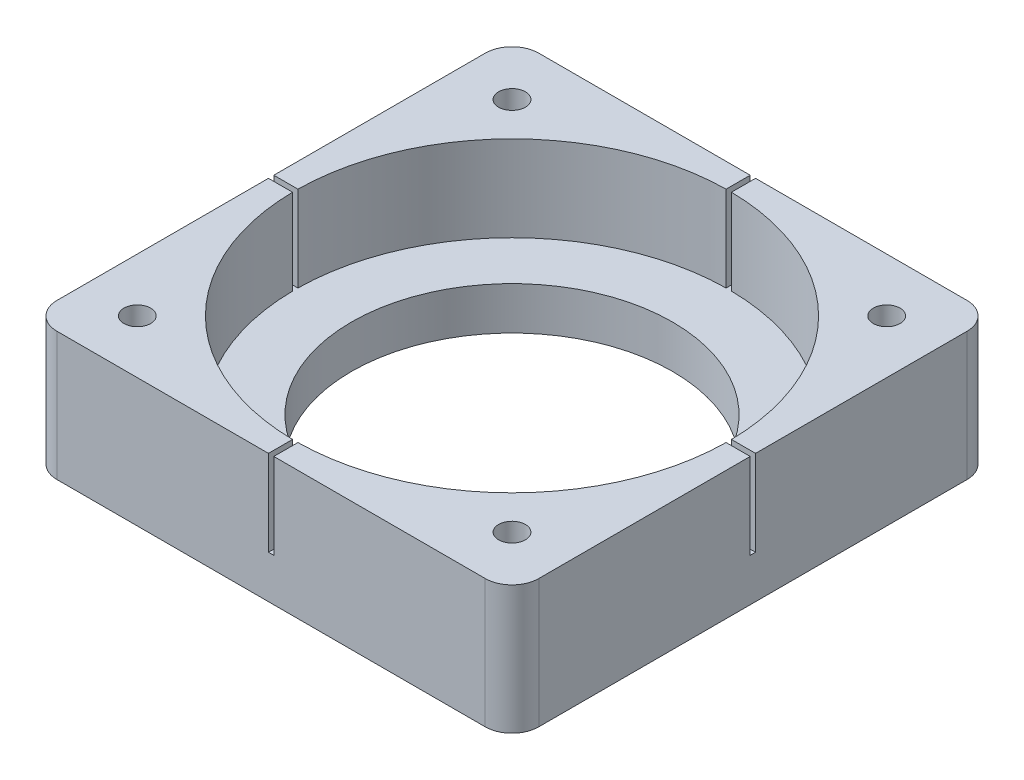
ISO-10303-21;
HEADER;
FILE_DESCRIPTION(('STEP AP214'),'2;1');
FILE_NAME('part.step','',(''),(''),'','','');
FILE_SCHEMA(('AUTOMOTIVE_DESIGN { 1 0 10303 214 1 1 1 1 }'));
ENDSEC;
DATA;
#1=APPLICATION_CONTEXT('core data for automotive mechanical design processes');
#2=APPLICATION_PROTOCOL_DEFINITION('international standard','automotive_design',2000,#1);
#3=PRODUCT_CONTEXT('',#1,'mechanical');
#4=PRODUCT('Part','Part','',(#3));
#5=PRODUCT_RELATED_PRODUCT_CATEGORY('part','',(#4));
#6=PRODUCT_DEFINITION_FORMATION('','',#4);
#7=PRODUCT_DEFINITION_CONTEXT('part definition',#1,'design');
#8=PRODUCT_DEFINITION('design','',#6,#7);
#9=PRODUCT_DEFINITION_SHAPE('','',#8);
#10=(LENGTH_UNIT() NAMED_UNIT(*) SI_UNIT(.MILLI.,.METRE.));
#11=(NAMED_UNIT(*) PLANE_ANGLE_UNIT() SI_UNIT($,.RADIAN.));
#12=(NAMED_UNIT(*) SI_UNIT($,.STERADIAN.) SOLID_ANGLE_UNIT());
#13=UNCERTAINTY_MEASURE_WITH_UNIT(LENGTH_MEASURE(1.E-05),#10,'distance_accuracy_value','');
#14=(GEOMETRIC_REPRESENTATION_CONTEXT(3) GLOBAL_UNCERTAINTY_ASSIGNED_CONTEXT((#13)) GLOBAL_UNIT_ASSIGNED_CONTEXT((#10,
#11,#12)) REPRESENTATION_CONTEXT('',''));
#15=CARTESIAN_POINT('',(0.,0.,0.));
#16=DIRECTION('',(0.,0.,1.));
#17=DIRECTION('',(1.,0.,0.));
#18=AXIS2_PLACEMENT_3D('',#15,#16,#17);
#19=CARTESIAN_POINT('',(0.,24.,0.));
#20=DIRECTION('',(0.,1.,0.));
#21=DIRECTION('',(0.,0.,1.));
#22=AXIS2_PLACEMENT_3D('',#19,#20,#21);
#23=PLANE('',#22);
#24=DIRECTION('',(0.,0.,-1.));
#25=VECTOR('',#24,1.);
#26=CARTESIAN_POINT('',(0.499999999999994,24.,-49.3592191642469));
#27=LINE('',#26,#25);
#28=CARTESIAN_POINT('',(0.499999999999996,24.,-40.4969134626332));
#29=VERTEX_POINT('',#28);
#30=CARTESIAN_POINT('',(0.499999999999995,24.,-44.9999999999999));
#31=VERTEX_POINT('',#30);
#32=EDGE_CURVE('E556',#29,#31,#27,.T.);
#33=ORIENTED_EDGE('',*,*,#32,.F.);
#34=CARTESIAN_POINT('',(0.,24.,0.));
#35=DIRECTION('',(0.,1.,0.));
#36=DIRECTION('',(0.,0.,1.));
#37=AXIS2_PLACEMENT_3D('',#34,#35,#36);
#38=CIRCLE('',#37,40.5);
#39=CARTESIAN_POINT('',(40.4969134626332,24.,-0.500000000001507));
#40=VERTEX_POINT('',#39);
#41=EDGE_CURVE('E331',#40,#29,#38,.T.);
#42=ORIENTED_EDGE('',*,*,#41,.F.);
#43=DIRECTION('',(-1.,0.,0.));
#44=VECTOR('',#43,1.);
#45=CARTESIAN_POINT('',(49.3592191642485,24.,-0.500000000001508));
#46=LINE('',#45,#44);
#47=CARTESIAN_POINT('',(45.,24.,-0.500000000001507));
#48=VERTEX_POINT('',#47);
#49=EDGE_CURVE('E549',#48,#40,#46,.T.);
#50=ORIENTED_EDGE('',*,*,#49,.F.);
#51=DIRECTION('',(0.,0.,-1.));
#52=VECTOR('',#51,1.);
#53=CARTESIAN_POINT('',(45.,24.,0.));
#54=LINE('',#53,#52);
#55=CARTESIAN_POINT('',(45.,24.,-39.9999999999999));
#56=VERTEX_POINT('',#55);
#57=EDGE_CURVE('E336',#48,#56,#54,.T.);
#58=ORIENTED_EDGE('',*,*,#57,.T.);
#59=CARTESIAN_POINT('',(40.,24.,-39.9999999999999));
#60=DIRECTION('',(0.,1.,0.));
#61=DIRECTION('',(0.,0.,1.));
#62=AXIS2_PLACEMENT_3D('',#59,#60,#61);
#63=CIRCLE('',#62,5.);
#64=CARTESIAN_POINT('',(40.,24.,-44.9999999999999));
#65=VERTEX_POINT('',#64);
#66=EDGE_CURVE('E403',#56,#65,#63,.T.);
#67=ORIENTED_EDGE('',*,*,#66,.T.);
#68=DIRECTION('',(1.,0.,0.));
#69=VECTOR('',#68,1.);
#70=CARTESIAN_POINT('',(0.,24.,-44.9999999999999));
#71=LINE('',#70,#69);
#72=EDGE_CURVE('E342',#31,#65,#71,.T.);
#73=ORIENTED_EDGE('',*,*,#72,.F.);
#74=EDGE_LOOP('',(#33,#42,#50,#58,#67,#73));
#75=FACE_BOUND('',#74,.T.);
#76=CARTESIAN_POINT('',(35.,24.,-35.));
#77=DIRECTION('',(0.,-1.,0.));
#78=DIRECTION('',(0.,0.,-1.));
#79=AXIS2_PLACEMENT_3D('',#76,#77,#78);
#80=CIRCLE('',#79,2.5);
#81=CARTESIAN_POINT('',(35.,24.,-37.5));
#82=VERTEX_POINT('',#81);
#83=EDGE_CURVE('E315',#82,#82,#80,.T.);
#84=ORIENTED_EDGE('',*,*,#83,.T.);
#85=EDGE_LOOP('',(#84));
#86=FACE_BOUND('',#85,.T.);
#87=ADVANCED_FACE('F72',(#75,#86),#23,.T.);
#88=DIRECTION('',(0.,0.,1.));
#89=VECTOR('',#88,1.);
#90=CARTESIAN_POINT('',(-0.500000000000006,24.,-49.3592191642469));
#91=LINE('',#90,#89);
#92=CARTESIAN_POINT('',(-0.500000000000006,24.,-44.9999999999999));
#93=VERTEX_POINT('',#92);
#94=CARTESIAN_POINT('',(-0.500000000000006,24.,-40.4969134626332));
#95=VERTEX_POINT('',#94);
#96=EDGE_CURVE('E559',#93,#95,#91,.T.);
#97=ORIENTED_EDGE('',*,*,#96,.F.);
#98=CARTESIAN_POINT('',(-40.,24.,-44.9999999999999));
#99=VERTEX_POINT('',#98);
#100=EDGE_CURVE('E343',#99,#93,#71,.T.);
#101=ORIENTED_EDGE('',*,*,#100,.F.);
#102=CARTESIAN_POINT('',(-40.,24.,-39.9999999999999));
#103=DIRECTION('',(0.,1.,0.));
#104=DIRECTION('',(0.,0.,1.));
#105=AXIS2_PLACEMENT_3D('',#102,#103,#104);
#106=CIRCLE('',#105,5.);
#107=CARTESIAN_POINT('',(-45.,24.,-39.9999999999999));
#108=VERTEX_POINT('',#107);
#109=EDGE_CURVE('E399',#99,#108,#106,.T.);
#110=ORIENTED_EDGE('',*,*,#109,.T.);
#111=DIRECTION('',(0.,0.,-1.));
#112=VECTOR('',#111,1.);
#113=CARTESIAN_POINT('',(-45.,24.,0.));
#114=LINE('',#113,#112);
#115=CARTESIAN_POINT('',(-45.,24.,-0.499999999998474));
#116=VERTEX_POINT('',#115);
#117=EDGE_CURVE('E347',#116,#108,#114,.T.);
#118=ORIENTED_EDGE('',*,*,#117,.F.);
#119=DIRECTION('',(-1.,0.,0.));
#120=VECTOR('',#119,1.);
#121=CARTESIAN_POINT('',(-49.3592191642454,24.,-0.499999999998472));
#122=LINE('',#121,#120);
#123=CARTESIAN_POINT('',(-40.4969134626332,24.,-0.499999999998476));
#124=VERTEX_POINT('',#123);
#125=EDGE_CURVE('E240',#124,#116,#122,.T.);
#126=ORIENTED_EDGE('',*,*,#125,.F.);
#127=EDGE_CURVE('E458',#95,#124,#38,.T.);
#128=ORIENTED_EDGE('',*,*,#127,.F.);
#129=EDGE_LOOP('',(#97,#101,#110,#118,#126,#128));
#130=FACE_BOUND('',#129,.T.);
#131=CARTESIAN_POINT('',(-35.,24.,-35.));
#132=DIRECTION('',(0.,-1.,0.));
#133=DIRECTION('',(0.,0.,-1.));
#134=AXIS2_PLACEMENT_3D('',#131,#132,#133);
#135=CIRCLE('',#134,2.5);
#136=CARTESIAN_POINT('',(-35.,24.,-37.5));
#137=VERTEX_POINT('',#136);
#138=EDGE_CURVE('E291',#137,#137,#135,.T.);
#139=ORIENTED_EDGE('',*,*,#138,.T.);
#140=EDGE_LOOP('',(#139));
#141=FACE_BOUND('',#140,.T.);
#142=ADVANCED_FACE('F590',(#130,#141),#23,.T.);
#143=DIRECTION('',(1.,0.,0.));
#144=VECTOR('',#143,1.);
#145=CARTESIAN_POINT('',(49.3592191642485,24.,0.499999999998492));
#146=LINE('',#145,#144);
#147=CARTESIAN_POINT('',(40.4969134626332,24.,0.499999999998495));
#148=VERTEX_POINT('',#147);
#149=CARTESIAN_POINT('',(45.,24.,0.499999999998494));
#150=VERTEX_POINT('',#149);
#151=EDGE_CURVE('E446',#148,#150,#146,.T.);
#152=ORIENTED_EDGE('',*,*,#151,.F.);
#153=CARTESIAN_POINT('',(0.500000000003022,24.,40.4969134626331));
#154=VERTEX_POINT('',#153);
#155=EDGE_CURVE('E327',#154,#148,#38,.T.);
#156=ORIENTED_EDGE('',*,*,#155,.F.);
#157=DIRECTION('',(0.,0.,-1.));
#158=VECTOR('',#157,1.);
#159=CARTESIAN_POINT('',(0.500000000003023,24.,49.359219164247));
#160=LINE('',#159,#158);
#161=CARTESIAN_POINT('',(0.500000000003023,24.,44.9999999999999));
#162=VERTEX_POINT('',#161);
#163=EDGE_CURVE('E448',#162,#154,#160,.T.);
#164=ORIENTED_EDGE('',*,*,#163,.F.);
#165=DIRECTION('',(1.,0.,0.));
#166=VECTOR('',#165,1.);
#167=CARTESIAN_POINT('',(0.,24.,44.9999999999999));
#168=LINE('',#167,#166);
#169=CARTESIAN_POINT('',(40.,24.,44.9999999999999));
#170=VERTEX_POINT('',#169);
#171=EDGE_CURVE('E337',#162,#170,#168,.T.);
#172=ORIENTED_EDGE('',*,*,#171,.T.);
#173=CARTESIAN_POINT('',(40.,24.,39.9999999999999));
#174=DIRECTION('',(0.,1.,0.));
#175=DIRECTION('',(0.,0.,1.));
#176=AXIS2_PLACEMENT_3D('',#173,#174,#175);
#177=CIRCLE('',#176,5.);
#178=CARTESIAN_POINT('',(45.,24.,39.9999999999999));
#179=VERTEX_POINT('',#178);
#180=EDGE_CURVE('E396',#170,#179,#177,.T.);
#181=ORIENTED_EDGE('',*,*,#180,.T.);
#182=EDGE_CURVE('E338',#179,#150,#54,.T.);
#183=ORIENTED_EDGE('',*,*,#182,.T.);
#184=EDGE_LOOP('',(#152,#156,#164,#172,#181,#183));
#185=FACE_BOUND('',#184,.T.);
#186=CARTESIAN_POINT('',(35.,24.,35.));
#187=DIRECTION('',(0.,-1.,0.));
#188=DIRECTION('',(0.,0.,-1.));
#189=AXIS2_PLACEMENT_3D('',#186,#187,#188);
#190=CIRCLE('',#189,2.5);
#191=CARTESIAN_POINT('',(35.,24.,32.5));
#192=VERTEX_POINT('',#191);
#193=EDGE_CURVE('E307',#192,#192,#190,.T.);
#194=ORIENTED_EDGE('',*,*,#193,.T.);
#195=EDGE_LOOP('',(#194));
#196=FACE_BOUND('',#195,.T.);
#197=ADVANCED_FACE('F443',(#185,#196),#23,.T.);
#198=CARTESIAN_POINT('',(0.,8.,0.));
#199=DIRECTION('',(0.,1.,0.));
#200=DIRECTION('',(0.,0.,1.));
#201=AXIS2_PLACEMENT_3D('',#198,#199,#200);
#202=CYLINDRICAL_SURFACE('',#201,40.5);
#203=ORIENTED_EDGE('',*,*,#41,.T.);
#204=DIRECTION('',(0.,1.,0.));
#205=VECTOR('',#204,1.);
#206=CARTESIAN_POINT('',(0.499999999999996,8.,-40.4969134626332));
#207=LINE('',#206,#205);
#208=CARTESIAN_POINT('',(0.499999999999996,8.,-40.4969134626332));
#209=VERTEX_POINT('',#208);
#210=EDGE_CURVE('E269',#29,#209,#207,.F.);
#211=ORIENTED_EDGE('',*,*,#210,.T.);
#212=CARTESIAN_POINT('',(0.,8.,0.));
#213=DIRECTION('',(0.,1.,0.));
#214=DIRECTION('',(0.,0.,1.));
#215=AXIS2_PLACEMENT_3D('',#212,#213,#214);
#216=CIRCLE('',#215,40.5);
#217=CARTESIAN_POINT('',(40.4969134626332,8.,-0.500000000001507));
#218=VERTEX_POINT('',#217);
#219=EDGE_CURVE('E325',#218,#209,#216,.T.);
#220=ORIENTED_EDGE('',*,*,#219,.F.);
#221=DIRECTION('',(0.,1.,0.));
#222=VECTOR('',#221,1.);
#223=CARTESIAN_POINT('',(40.4969134626332,8.,-0.500000000001507));
#224=LINE('',#223,#222);
#225=EDGE_CURVE('E519',#218,#40,#224,.T.);
#226=ORIENTED_EDGE('',*,*,#225,.T.);
#227=EDGE_LOOP('',(#203,#211,#220,#226));
#228=FACE_BOUND('',#227,.T.);
#229=ADVANCED_FACE('F537',(#228),#202,.F.);
#230=CARTESIAN_POINT('',(-0.500000000000006,8.,-40.4969134626332));
#231=VERTEX_POINT('',#230);
#232=CARTESIAN_POINT('',(-40.4969134626332,8.,-0.499999999998476));
#233=VERTEX_POINT('',#232);
#234=EDGE_CURVE('E253',#231,#233,#216,.T.);
#235=ORIENTED_EDGE('',*,*,#234,.F.);
#236=DIRECTION('',(0.,1.,0.));
#237=VECTOR('',#236,1.);
#238=CARTESIAN_POINT('',(-0.500000000000006,8.,-40.4969134626332));
#239=LINE('',#238,#237);
#240=EDGE_CURVE('E527',#231,#95,#239,.T.);
#241=ORIENTED_EDGE('',*,*,#240,.T.);
#242=ORIENTED_EDGE('',*,*,#127,.T.);
#243=DIRECTION('',(0.,1.,0.));
#244=VECTOR('',#243,1.);
#245=CARTESIAN_POINT('',(-40.4969134626332,8.,-0.499999999998476));
#246=LINE('',#245,#244);
#247=EDGE_CURVE('E246',#124,#233,#246,.F.);
#248=ORIENTED_EDGE('',*,*,#247,.T.);
#249=EDGE_LOOP('',(#235,#241,#242,#248));
#250=FACE_BOUND('',#249,.T.);
#251=ADVANCED_FACE('F610',(#250),#202,.F.);
#252=ORIENTED_EDGE('',*,*,#155,.T.);
#253=DIRECTION('',(0.,1.,0.));
#254=VECTOR('',#253,1.);
#255=CARTESIAN_POINT('',(40.4969134626332,8.,0.499999999998495));
#256=LINE('',#255,#254);
#257=CARTESIAN_POINT('',(40.4969134626332,8.,0.499999999998495));
#258=VERTEX_POINT('',#257);
#259=EDGE_CURVE('E513',#148,#258,#256,.F.);
#260=ORIENTED_EDGE('',*,*,#259,.T.);
#261=CARTESIAN_POINT('',(0.500000000003022,8.,40.4969134626331));
#262=VERTEX_POINT('',#261);
#263=EDGE_CURVE('E320',#262,#258,#216,.T.);
#264=ORIENTED_EDGE('',*,*,#263,.F.);
#265=DIRECTION('',(0.,1.,0.));
#266=VECTOR('',#265,1.);
#267=CARTESIAN_POINT('',(0.500000000003022,8.,40.4969134626331));
#268=LINE('',#267,#266);
#269=EDGE_CURVE('E506',#262,#154,#268,.T.);
#270=ORIENTED_EDGE('',*,*,#269,.T.);
#271=EDGE_LOOP('',(#252,#260,#264,#270));
#272=FACE_BOUND('',#271,.T.);
#273=ADVANCED_FACE('F614',(#272),#202,.F.);
#274=CARTESIAN_POINT('',(0.,24.,44.9999999999999));
#275=DIRECTION('',(0.,0.,-1.));
#276=DIRECTION('',(-1.,0.,0.));
#277=AXIS2_PLACEMENT_3D('',#274,#275,#276);
#278=PLANE('',#277);
#279=ORIENTED_EDGE('',*,*,#171,.F.);
#280=DIRECTION('',(0.,-1.,0.));
#281=VECTOR('',#280,1.);
#282=CARTESIAN_POINT('',(0.500000000003023,24.,44.9999999999999));
#283=LINE('',#282,#281);
#284=CARTESIAN_POINT('',(0.500000000003023,8.,44.9999999999999));
#285=VERTEX_POINT('',#284);
#286=EDGE_CURVE('E510',#162,#285,#283,.T.);
#287=ORIENTED_EDGE('',*,*,#286,.T.);
#288=DIRECTION('',(1.,0.,0.));
#289=VECTOR('',#288,1.);
#290=CARTESIAN_POINT('',(0.,8.,44.9999999999999));
#291=LINE('',#290,#289);
#292=CARTESIAN_POINT('',(-0.499999999996979,8.,44.9999999999999));
#293=VERTEX_POINT('',#292);
#294=EDGE_CURVE('E262',#293,#285,#291,.T.);
#295=ORIENTED_EDGE('',*,*,#294,.F.);
#296=DIRECTION('',(0.,1.,0.));
#297=VECTOR('',#296,1.);
#298=CARTESIAN_POINT('',(-0.499999999996979,24.,44.9999999999999));
#299=LINE('',#298,#297);
#300=CARTESIAN_POINT('',(-0.499999999996979,24.,44.9999999999999));
#301=VERTEX_POINT('',#300);
#302=EDGE_CURVE('E503',#293,#301,#299,.T.);
#303=ORIENTED_EDGE('',*,*,#302,.T.);
#304=CARTESIAN_POINT('',(-40.,24.,44.9999999999999));
#305=VERTEX_POINT('',#304);
#306=EDGE_CURVE('E332',#305,#301,#168,.T.);
#307=ORIENTED_EDGE('',*,*,#306,.F.);
#308=DIRECTION('',(0.,-1.,0.));
#309=VECTOR('',#308,1.);
#310=CARTESIAN_POINT('',(-40.,0.,44.9999999999999));
#311=LINE('',#310,#309);
#312=CARTESIAN_POINT('',(-40.,0.,44.9999999999999));
#313=VERTEX_POINT('',#312);
#314=EDGE_CURVE('E81',#305,#313,#311,.T.);
#315=ORIENTED_EDGE('',*,*,#314,.T.);
#316=DIRECTION('',(1.,0.,0.));
#317=VECTOR('',#316,1.);
#318=CARTESIAN_POINT('',(0.,0.,44.9999999999999));
#319=LINE('',#318,#317);
#320=CARTESIAN_POINT('',(40.,0.,44.9999999999999));
#321=VERTEX_POINT('',#320);
#322=EDGE_CURVE('E324',#313,#321,#319,.T.);
#323=ORIENTED_EDGE('',*,*,#322,.T.);
#324=DIRECTION('',(0.,-1.,0.));
#325=VECTOR('',#324,1.);
#326=CARTESIAN_POINT('',(40.,24.,44.9999999999999));
#327=LINE('',#326,#325);
#328=EDGE_CURVE('E12',#321,#170,#327,.F.);
#329=ORIENTED_EDGE('',*,*,#328,.T.);
#330=EDGE_LOOP('',(#279,#287,#295,#303,#307,#315,#323,#329));
#331=FACE_BOUND('',#330,.T.);
#332=ADVANCED_FACE('F420',(#331),#278,.F.);
#333=CARTESIAN_POINT('',(45.,24.,0.));
#334=DIRECTION('',(-1.,0.,0.));
#335=DIRECTION('',(0.,0.,1.));
#336=AXIS2_PLACEMENT_3D('',#333,#334,#335);
#337=PLANE('',#336);
#338=ORIENTED_EDGE('',*,*,#57,.F.);
#339=DIRECTION('',(0.,-1.,0.));
#340=VECTOR('',#339,1.);
#341=CARTESIAN_POINT('',(45.,24.,-0.500000000001507));
#342=LINE('',#341,#340);
#343=CARTESIAN_POINT('',(45.,8.,-0.500000000001507));
#344=VERTEX_POINT('',#343);
#345=EDGE_CURVE('E523',#48,#344,#342,.T.);
#346=ORIENTED_EDGE('',*,*,#345,.T.);
#347=DIRECTION('',(0.,0.,-1.));
#348=VECTOR('',#347,1.);
#349=CARTESIAN_POINT('',(45.,8.,0.));
#350=LINE('',#349,#348);
#351=CARTESIAN_POINT('',(45.,8.,0.499999999998494));
#352=VERTEX_POINT('',#351);
#353=EDGE_CURVE('E267',#352,#344,#350,.T.);
#354=ORIENTED_EDGE('',*,*,#353,.F.);
#355=DIRECTION('',(0.,1.,0.));
#356=VECTOR('',#355,1.);
#357=CARTESIAN_POINT('',(45.,24.,0.499999999998494));
#358=LINE('',#357,#356);
#359=EDGE_CURVE('E440',#352,#150,#358,.T.);
#360=ORIENTED_EDGE('',*,*,#359,.T.);
#361=ORIENTED_EDGE('',*,*,#182,.F.);
#362=DIRECTION('',(0.,-1.,0.));
#363=VECTOR('',#362,1.);
#364=CARTESIAN_POINT('',(45.,24.,39.9999999999999));
#365=LINE('',#364,#363);
#366=CARTESIAN_POINT('',(45.,0.,39.9999999999999));
#367=VERTEX_POINT('',#366);
#368=EDGE_CURVE('E385',#179,#367,#365,.T.);
#369=ORIENTED_EDGE('',*,*,#368,.T.);
#370=DIRECTION('',(0.,0.,-1.));
#371=VECTOR('',#370,1.);
#372=CARTESIAN_POINT('',(45.,0.,0.));
#373=LINE('',#372,#371);
#374=CARTESIAN_POINT('',(45.,0.,-39.9999999999999));
#375=VERTEX_POINT('',#374);
#376=EDGE_CURVE('E355',#367,#375,#373,.T.);
#377=ORIENTED_EDGE('',*,*,#376,.T.);
#378=DIRECTION('',(0.,-1.,0.));
#379=VECTOR('',#378,1.);
#380=CARTESIAN_POINT('',(45.,24.,-39.9999999999999));
#381=LINE('',#380,#379);
#382=EDGE_CURVE('E389',#375,#56,#381,.F.);
#383=ORIENTED_EDGE('',*,*,#382,.T.);
#384=EDGE_LOOP('',(#338,#346,#354,#360,#361,#369,#377,#383));
#385=FACE_BOUND('',#384,.T.);
#386=ADVANCED_FACE('F436',(#385),#337,.F.);
#387=CARTESIAN_POINT('',(0.,24.,-44.9999999999999));
#388=DIRECTION('',(0.,0.,-1.));
#389=DIRECTION('',(-1.,0.,0.));
#390=AXIS2_PLACEMENT_3D('',#387,#388,#389);
#391=PLANE('',#390);
#392=DIRECTION('',(0.,-1.,0.));
#393=VECTOR('',#392,1.);
#394=CARTESIAN_POINT('',(0.499999999999995,24.,-44.9999999999999));
#395=LINE('',#394,#393);
#396=CARTESIAN_POINT('',(0.499999999999995,8.,-44.9999999999999));
#397=VERTEX_POINT('',#396);
#398=EDGE_CURVE('E263',#31,#397,#395,.T.);
#399=ORIENTED_EDGE('',*,*,#398,.F.);
#400=ORIENTED_EDGE('',*,*,#72,.T.);
#401=DIRECTION('',(0.,-1.,0.));
#402=VECTOR('',#401,1.);
#403=CARTESIAN_POINT('',(40.,0.,-44.9999999999999));
#404=LINE('',#403,#402);
#405=CARTESIAN_POINT('',(40.,0.,-44.9999999999999));
#406=VERTEX_POINT('',#405);
#407=EDGE_CURVE('E369',#65,#406,#404,.T.);
#408=ORIENTED_EDGE('',*,*,#407,.T.);
#409=DIRECTION('',(1.,0.,0.));
#410=VECTOR('',#409,1.);
#411=CARTESIAN_POINT('',(0.,0.,-44.9999999999999));
#412=LINE('',#411,#410);
#413=CARTESIAN_POINT('',(-40.,0.,-44.9999999999999));
#414=VERTEX_POINT('',#413);
#415=EDGE_CURVE('E359',#414,#406,#412,.T.);
#416=ORIENTED_EDGE('',*,*,#415,.F.);
#417=DIRECTION('',(0.,-1.,0.));
#418=VECTOR('',#417,1.);
#419=CARTESIAN_POINT('',(-40.,24.,-44.9999999999999));
#420=LINE('',#419,#418);
#421=EDGE_CURVE('E351',#414,#99,#420,.F.);
#422=ORIENTED_EDGE('',*,*,#421,.T.);
#423=ORIENTED_EDGE('',*,*,#100,.T.);
#424=DIRECTION('',(0.,1.,0.));
#425=VECTOR('',#424,1.);
#426=CARTESIAN_POINT('',(-0.500000000000006,24.,-44.9999999999999));
#427=LINE('',#426,#425);
#428=CARTESIAN_POINT('',(-0.500000000000006,8.,-44.9999999999999));
#429=VERTEX_POINT('',#428);
#430=EDGE_CURVE('E531',#429,#93,#427,.T.);
#431=ORIENTED_EDGE('',*,*,#430,.F.);
#432=DIRECTION('',(1.,0.,0.));
#433=VECTOR('',#432,1.);
#434=CARTESIAN_POINT('',(0.,8.,-44.9999999999999));
#435=LINE('',#434,#433);
#436=EDGE_CURVE('E275',#429,#397,#435,.T.);
#437=ORIENTED_EDGE('',*,*,#436,.T.);
#438=EDGE_LOOP('',(#399,#400,#408,#416,#422,#423,#431,#437));
#439=FACE_BOUND('',#438,.T.);
#440=ADVANCED_FACE('F604',(#439),#391,.T.);
#441=CARTESIAN_POINT('',(-45.,24.,0.));
#442=DIRECTION('',(-1.,0.,0.));
#443=DIRECTION('',(0.,0.,1.));
#444=AXIS2_PLACEMENT_3D('',#441,#442,#443);
#445=PLANE('',#444);
#446=DIRECTION('',(0.,1.,0.));
#447=VECTOR('',#446,1.);
#448=CARTESIAN_POINT('',(-45.,24.,0.500000000001527));
#449=LINE('',#448,#447);
#450=CARTESIAN_POINT('',(-45.,8.,0.500000000001527));
#451=VERTEX_POINT('',#450);
#452=CARTESIAN_POINT('',(-45.,24.,0.500000000001527));
#453=VERTEX_POINT('',#452);
#454=EDGE_CURVE('E260',#451,#453,#449,.T.);
#455=ORIENTED_EDGE('',*,*,#454,.F.);
#456=DIRECTION('',(0.,0.,-1.));
#457=VECTOR('',#456,1.);
#458=CARTESIAN_POINT('',(-45.,8.,0.));
#459=LINE('',#458,#457);
#460=CARTESIAN_POINT('',(-45.,8.,-0.499999999998474));
#461=VERTEX_POINT('',#460);
#462=EDGE_CURVE('E251',#451,#461,#459,.T.);
#463=ORIENTED_EDGE('',*,*,#462,.T.);
#464=DIRECTION('',(0.,-1.,0.));
#465=VECTOR('',#464,1.);
#466=CARTESIAN_POINT('',(-45.,24.,-0.499999999998474));
#467=LINE('',#466,#465);
#468=EDGE_CURVE('E234',#116,#461,#467,.T.);
#469=ORIENTED_EDGE('',*,*,#468,.F.);
#470=ORIENTED_EDGE('',*,*,#117,.T.);
#471=DIRECTION('',(0.,-1.,0.));
#472=VECTOR('',#471,1.);
#473=CARTESIAN_POINT('',(-45.,24.,-39.9999999999999));
#474=LINE('',#473,#472);
#475=CARTESIAN_POINT('',(-45.,0.,-39.9999999999999));
#476=VERTEX_POINT('',#475);
#477=EDGE_CURVE('E410',#108,#476,#474,.T.);
#478=ORIENTED_EDGE('',*,*,#477,.T.);
#479=DIRECTION('',(0.,0.,-1.));
#480=VECTOR('',#479,1.);
#481=CARTESIAN_POINT('',(-45.,0.,0.));
#482=LINE('',#481,#480);
#483=CARTESIAN_POINT('',(-45.,0.,39.9999999999999));
#484=VERTEX_POINT('',#483);
#485=EDGE_CURVE('E363',#484,#476,#482,.T.);
#486=ORIENTED_EDGE('',*,*,#485,.F.);
#487=DIRECTION('',(0.,-1.,0.));
#488=VECTOR('',#487,1.);
#489=CARTESIAN_POINT('',(-45.,24.,39.9999999999999));
#490=LINE('',#489,#488);
#491=CARTESIAN_POINT('',(-45.,24.,39.9999999999999));
#492=VERTEX_POINT('',#491);
#493=EDGE_CURVE('E407',#484,#492,#490,.F.);
#494=ORIENTED_EDGE('',*,*,#493,.T.);
#495=EDGE_CURVE('E348',#492,#453,#114,.T.);
#496=ORIENTED_EDGE('',*,*,#495,.T.);
#497=EDGE_LOOP('',(#455,#463,#469,#470,#478,#486,#494,#496));
#498=FACE_BOUND('',#497,.T.);
#499=ADVANCED_FACE('F258',(#498),#445,.T.);
#500=DIRECTION('',(0.,0.,1.));
#501=VECTOR('',#500,1.);
#502=CARTESIAN_POINT('',(-0.499999999996977,24.,49.359219164247));
#503=LINE('',#502,#501);
#504=CARTESIAN_POINT('',(-0.49999999999698,24.,40.4969134626332));
#505=VERTEX_POINT('',#504);
#506=EDGE_CURVE('E255',#505,#301,#503,.T.);
#507=ORIENTED_EDGE('',*,*,#506,.F.);
#508=CARTESIAN_POINT('',(-40.4969134626332,24.,0.500000000001526));
#509=VERTEX_POINT('',#508);
#510=EDGE_CURVE('E319',#509,#505,#38,.T.);
#511=ORIENTED_EDGE('',*,*,#510,.F.);
#512=DIRECTION('',(1.,0.,0.));
#513=VECTOR('',#512,1.);
#514=CARTESIAN_POINT('',(-49.3592191642454,24.,0.500000000001528));
#515=LINE('',#514,#513);
#516=EDGE_CURVE('E475',#453,#509,#515,.T.);
#517=ORIENTED_EDGE('',*,*,#516,.F.);
#518=ORIENTED_EDGE('',*,*,#495,.F.);
#519=CARTESIAN_POINT('',(-40.,24.,39.9999999999999));
#520=DIRECTION('',(0.,1.,0.));
#521=DIRECTION('',(0.,0.,1.));
#522=AXIS2_PLACEMENT_3D('',#519,#520,#521);
#523=CIRCLE('',#522,5.);
#524=EDGE_CURVE('E393',#492,#305,#523,.T.);
#525=ORIENTED_EDGE('',*,*,#524,.T.);
#526=ORIENTED_EDGE('',*,*,#306,.T.);
#527=EDGE_LOOP('',(#507,#511,#517,#518,#525,#526));
#528=FACE_BOUND('',#527,.T.);
#529=CARTESIAN_POINT('',(-35.,24.,35.));
#530=DIRECTION('',(0.,-1.,0.));
#531=DIRECTION('',(0.,0.,-1.));
#532=AXIS2_PLACEMENT_3D('',#529,#530,#531);
#533=CIRCLE('',#532,2.5);
#534=CARTESIAN_POINT('',(-35.,24.,32.5));
#535=VERTEX_POINT('',#534);
#536=EDGE_CURVE('E299',#535,#535,#533,.T.);
#537=ORIENTED_EDGE('',*,*,#536,.T.);
#538=EDGE_LOOP('',(#537));
#539=FACE_BOUND('',#538,.T.);
#540=ADVANCED_FACE('F472',(#528,#539),#23,.T.);
#541=CARTESIAN_POINT('',(0.,0.,0.));
#542=DIRECTION('',(0.,1.,0.));
#543=DIRECTION('',(0.,0.,1.));
#544=AXIS2_PLACEMENT_3D('',#541,#542,#543);
#545=PLANE('',#544);
#546=CARTESIAN_POINT('',(0.,0.,0.));
#547=DIRECTION('',(0.,1.,0.));
#548=DIRECTION('',(0.,0.,1.));
#549=AXIS2_PLACEMENT_3D('',#546,#547,#548);
#550=CIRCLE('',#549,30.);
#551=CARTESIAN_POINT('',(0.,0.,30.));
#552=VERTEX_POINT('',#551);
#553=EDGE_CURVE('E280',#552,#552,#550,.T.);
#554=ORIENTED_EDGE('',*,*,#553,.T.);
#555=EDGE_LOOP('',(#554));
#556=FACE_BOUND('',#555,.T.);
#557=CARTESIAN_POINT('',(-35.,0.,-35.));
#558=DIRECTION('',(0.,-1.,0.));
#559=DIRECTION('',(0.,0.,-1.));
#560=AXIS2_PLACEMENT_3D('',#557,#558,#559);
#561=CIRCLE('',#560,2.49999999999999);
#562=CARTESIAN_POINT('',(-35.,0.,-37.5));
#563=VERTEX_POINT('',#562);
#564=EDGE_CURVE('E284',#563,#563,#561,.T.);
#565=ORIENTED_EDGE('',*,*,#564,.F.);
#566=EDGE_LOOP('',(#565));
#567=FACE_BOUND('',#566,.T.);
#568=CARTESIAN_POINT('',(-35.,0.,35.));
#569=DIRECTION('',(0.,-1.,0.));
#570=DIRECTION('',(0.,0.,-1.));
#571=AXIS2_PLACEMENT_3D('',#568,#569,#570);
#572=CIRCLE('',#571,2.49999999999999);
#573=CARTESIAN_POINT('',(-35.,0.,32.5));
#574=VERTEX_POINT('',#573);
#575=EDGE_CURVE('E295',#574,#574,#572,.T.);
#576=ORIENTED_EDGE('',*,*,#575,.F.);
#577=EDGE_LOOP('',(#576));
#578=FACE_BOUND('',#577,.T.);
#579=CARTESIAN_POINT('',(35.,0.,35.));
#580=DIRECTION('',(0.,-1.,0.));
#581=DIRECTION('',(0.,0.,-1.));
#582=AXIS2_PLACEMENT_3D('',#579,#580,#581);
#583=CIRCLE('',#582,2.49999999999999);
#584=CARTESIAN_POINT('',(35.,0.,32.5));
#585=VERTEX_POINT('',#584);
#586=EDGE_CURVE('E303',#585,#585,#583,.T.);
#587=ORIENTED_EDGE('',*,*,#586,.F.);
#588=EDGE_LOOP('',(#587));
#589=FACE_BOUND('',#588,.T.);
#590=CARTESIAN_POINT('',(35.,0.,-35.));
#591=DIRECTION('',(0.,-1.,0.));
#592=DIRECTION('',(0.,0.,-1.));
#593=AXIS2_PLACEMENT_3D('',#590,#591,#592);
#594=CIRCLE('',#593,2.49999999999999);
#595=CARTESIAN_POINT('',(35.,0.,-37.5));
#596=VERTEX_POINT('',#595);
#597=EDGE_CURVE('E311',#596,#596,#594,.T.);
#598=ORIENTED_EDGE('',*,*,#597,.F.);
#599=EDGE_LOOP('',(#598));
#600=FACE_BOUND('',#599,.T.);
#601=ORIENTED_EDGE('',*,*,#415,.T.);
#602=CARTESIAN_POINT('',(40.,0.,-39.9999999999999));
#603=DIRECTION('',(0.,1.,0.));
#604=DIRECTION('',(0.,0.,1.));
#605=AXIS2_PLACEMENT_3D('',#602,#603,#604);
#606=CIRCLE('',#605,5.);
#607=EDGE_CURVE('E382',#406,#375,#606,.F.);
#608=ORIENTED_EDGE('',*,*,#607,.T.);
#609=ORIENTED_EDGE('',*,*,#376,.F.);
#610=CARTESIAN_POINT('',(40.,0.,39.9999999999999));
#611=DIRECTION('',(0.,1.,0.));
#612=DIRECTION('',(0.,0.,1.));
#613=AXIS2_PLACEMENT_3D('',#610,#611,#612);
#614=CIRCLE('',#613,5.);
#615=EDGE_CURVE('E376',#367,#321,#614,.F.);
#616=ORIENTED_EDGE('',*,*,#615,.T.);
#617=ORIENTED_EDGE('',*,*,#322,.F.);
#618=CARTESIAN_POINT('',(-40.,0.,39.9999999999999));
#619=DIRECTION('',(0.,1.,0.));
#620=DIRECTION('',(0.,0.,1.));
#621=AXIS2_PLACEMENT_3D('',#618,#619,#620);
#622=CIRCLE('',#621,5.);
#623=EDGE_CURVE('E373',#313,#484,#622,.F.);
#624=ORIENTED_EDGE('',*,*,#623,.T.);
#625=ORIENTED_EDGE('',*,*,#485,.T.);
#626=CARTESIAN_POINT('',(-40.,0.,-39.9999999999999));
#627=DIRECTION('',(0.,1.,0.));
#628=DIRECTION('',(0.,0.,1.));
#629=AXIS2_PLACEMENT_3D('',#626,#627,#628);
#630=CIRCLE('',#629,5.);
#631=EDGE_CURVE('E379',#476,#414,#630,.F.);
#632=ORIENTED_EDGE('',*,*,#631,.T.);
#633=EDGE_LOOP('',(#601,#608,#609,#616,#617,#624,#625,#632));
#634=FACE_BOUND('',#633,.T.);
#635=ADVANCED_FACE('F426',(#556,#567,#578,#589,#600,#634),#545,.F.);
#636=ORIENTED_EDGE('',*,*,#510,.T.);
#637=DIRECTION('',(0.,1.,0.));
#638=VECTOR('',#637,1.);
#639=CARTESIAN_POINT('',(-0.49999999999698,8.,40.4969134626332));
#640=LINE('',#639,#638);
#641=CARTESIAN_POINT('',(-0.49999999999698,8.,40.4969134626332));
#642=VERTEX_POINT('',#641);
#643=EDGE_CURVE('E468',#505,#642,#640,.F.);
#644=ORIENTED_EDGE('',*,*,#643,.T.);
#645=CARTESIAN_POINT('',(-40.4969134626332,8.,0.500000000001526));
#646=VERTEX_POINT('',#645);
#647=EDGE_CURVE('E326',#646,#642,#216,.T.);
#648=ORIENTED_EDGE('',*,*,#647,.F.);
#649=DIRECTION('',(0.,1.,0.));
#650=VECTOR('',#649,1.);
#651=CARTESIAN_POINT('',(-40.4969134626332,8.,0.500000000001526));
#652=LINE('',#651,#650);
#653=EDGE_CURVE('E245',#646,#509,#652,.T.);
#654=ORIENTED_EDGE('',*,*,#653,.T.);
#655=EDGE_LOOP('',(#636,#644,#648,#654));
#656=FACE_BOUND('',#655,.T.);
#657=ADVANCED_FACE('F466',(#656),#202,.F.);
#658=CARTESIAN_POINT('',(0.,8.,0.));
#659=DIRECTION('',(0.,1.,0.));
#660=DIRECTION('',(0.,0.,1.));
#661=AXIS2_PLACEMENT_3D('',#658,#659,#660);
#662=PLANE('',#661);
#663=ORIENTED_EDGE('',*,*,#219,.T.);
#664=DIRECTION('',(0.,0.,1.));
#665=VECTOR('',#664,1.);
#666=CARTESIAN_POINT('',(0.499999999999994,8.,-49.3592191642469));
#667=LINE('',#666,#665);
#668=EDGE_CURVE('E495',#397,#209,#667,.T.);
#669=ORIENTED_EDGE('',*,*,#668,.F.);
#670=ORIENTED_EDGE('',*,*,#436,.F.);
#671=DIRECTION('',(0.,0.,-1.));
#672=VECTOR('',#671,1.);
#673=CARTESIAN_POINT('',(-0.500000000000006,8.,-49.3592191642469));
#674=LINE('',#673,#672);
#675=EDGE_CURVE('E95',#231,#429,#674,.T.);
#676=ORIENTED_EDGE('',*,*,#675,.F.);
#677=ORIENTED_EDGE('',*,*,#234,.T.);
#678=DIRECTION('',(1.,0.,0.));
#679=VECTOR('',#678,1.);
#680=CARTESIAN_POINT('',(-49.3592191642454,8.,-0.499999999998472));
#681=LINE('',#680,#679);
#682=EDGE_CURVE('E237',#461,#233,#681,.T.);
#683=ORIENTED_EDGE('',*,*,#682,.F.);
#684=ORIENTED_EDGE('',*,*,#462,.F.);
#685=DIRECTION('',(-1.,0.,0.));
#686=VECTOR('',#685,1.);
#687=CARTESIAN_POINT('',(-49.3592191642454,8.,0.500000000001528));
#688=LINE('',#687,#686);
#689=EDGE_CURVE('E88',#646,#451,#688,.T.);
#690=ORIENTED_EDGE('',*,*,#689,.F.);
#691=ORIENTED_EDGE('',*,*,#647,.T.);
#692=DIRECTION('',(0.,0.,-1.));
#693=VECTOR('',#692,1.);
#694=CARTESIAN_POINT('',(-0.499999999996977,8.,49.359219164247));
#695=LINE('',#694,#693);
#696=EDGE_CURVE('E485',#293,#642,#695,.T.);
#697=ORIENTED_EDGE('',*,*,#696,.F.);
#698=ORIENTED_EDGE('',*,*,#294,.T.);
#699=DIRECTION('',(0.,0.,1.));
#700=VECTOR('',#699,1.);
#701=CARTESIAN_POINT('',(0.500000000003023,8.,49.359219164247));
#702=LINE('',#701,#700);
#703=EDGE_CURVE('E480',#262,#285,#702,.T.);
#704=ORIENTED_EDGE('',*,*,#703,.F.);
#705=ORIENTED_EDGE('',*,*,#263,.T.);
#706=DIRECTION('',(-1.,0.,0.));
#707=VECTOR('',#706,1.);
#708=CARTESIAN_POINT('',(49.3592191642485,8.,0.499999999998492));
#709=LINE('',#708,#707);
#710=EDGE_CURVE('E548',#352,#258,#709,.T.);
#711=ORIENTED_EDGE('',*,*,#710,.F.);
#712=ORIENTED_EDGE('',*,*,#353,.T.);
#713=DIRECTION('',(1.,0.,0.));
#714=VECTOR('',#713,1.);
#715=CARTESIAN_POINT('',(49.3592191642485,8.,-0.500000000001508));
#716=LINE('',#715,#714);
#717=EDGE_CURVE('E543',#218,#344,#716,.T.);
#718=ORIENTED_EDGE('',*,*,#717,.F.);
#719=EDGE_LOOP('',(#663,#669,#670,#676,#677,#683,#684,#690,#691,#697,#698,#704,#705,#711,#712,#718));
#720=FACE_BOUND('',#719,.T.);
#721=CARTESIAN_POINT('',(0.,8.,0.));
#722=DIRECTION('',(0.,1.,0.));
#723=DIRECTION('',(0.,0.,1.));
#724=AXIS2_PLACEMENT_3D('',#721,#722,#723);
#725=CIRCLE('',#724,30.);
#726=CARTESIAN_POINT('',(0.,8.,30.));
#727=VERTEX_POINT('',#726);
#728=EDGE_CURVE('E279',#727,#727,#725,.T.);
#729=ORIENTED_EDGE('',*,*,#728,.F.);
#730=EDGE_LOOP('',(#729));
#731=FACE_BOUND('',#730,.T.);
#732=ADVANCED_FACE('F249',(#720,#731),#662,.T.);
#733=CARTESIAN_POINT('',(35.,0.,-35.));
#734=DIRECTION('',(0.,-1.,0.));
#735=DIRECTION('',(0.,0.,-1.));
#736=AXIS2_PLACEMENT_3D('',#733,#734,#735);
#737=CYLINDRICAL_SURFACE('',#736,2.49999999999999);
#738=ORIENTED_EDGE('',*,*,#83,.F.);
#739=EDGE_LOOP('',(#738));
#740=FACE_BOUND('',#739,.T.);
#741=ORIENTED_EDGE('',*,*,#597,.T.);
#742=EDGE_LOOP('',(#741));
#743=FACE_BOUND('',#742,.T.);
#744=ADVANCED_FACE('F621',(#740,#743),#737,.F.);
#745=CARTESIAN_POINT('',(35.,0.,35.));
#746=DIRECTION('',(0.,-1.,0.));
#747=DIRECTION('',(0.,0.,-1.));
#748=AXIS2_PLACEMENT_3D('',#745,#746,#747);
#749=CYLINDRICAL_SURFACE('',#748,2.49999999999999);
#750=ORIENTED_EDGE('',*,*,#193,.F.);
#751=EDGE_LOOP('',(#750));
#752=FACE_BOUND('',#751,.T.);
#753=ORIENTED_EDGE('',*,*,#586,.T.);
#754=EDGE_LOOP('',(#753));
#755=FACE_BOUND('',#754,.T.);
#756=ADVANCED_FACE('F679',(#752,#755),#749,.F.);
#757=CARTESIAN_POINT('',(-35.,0.,35.));
#758=DIRECTION('',(0.,-1.,0.));
#759=DIRECTION('',(0.,0.,-1.));
#760=AXIS2_PLACEMENT_3D('',#757,#758,#759);
#761=CYLINDRICAL_SURFACE('',#760,2.49999999999999);
#762=ORIENTED_EDGE('',*,*,#536,.F.);
#763=EDGE_LOOP('',(#762));
#764=FACE_BOUND('',#763,.T.);
#765=ORIENTED_EDGE('',*,*,#575,.T.);
#766=EDGE_LOOP('',(#765));
#767=FACE_BOUND('',#766,.T.);
#768=ADVANCED_FACE('F653',(#764,#767),#761,.F.);
#769=CARTESIAN_POINT('',(-35.,0.,-35.));
#770=DIRECTION('',(0.,-1.,0.));
#771=DIRECTION('',(0.,0.,-1.));
#772=AXIS2_PLACEMENT_3D('',#769,#770,#771);
#773=CYLINDRICAL_SURFACE('',#772,2.49999999999999);
#774=ORIENTED_EDGE('',*,*,#138,.F.);
#775=EDGE_LOOP('',(#774));
#776=FACE_BOUND('',#775,.T.);
#777=ORIENTED_EDGE('',*,*,#564,.T.);
#778=EDGE_LOOP('',(#777));
#779=FACE_BOUND('',#778,.T.);
#780=ADVANCED_FACE('F646',(#776,#779),#773,.F.);
#781=CARTESIAN_POINT('',(40.,24.,-39.9999999999999));
#782=DIRECTION('',(0.,1.,0.));
#783=DIRECTION('',(0.,0.,1.));
#784=AXIS2_PLACEMENT_3D('',#781,#782,#783);
#785=CYLINDRICAL_SURFACE('',#784,5.);
#786=ORIENTED_EDGE('',*,*,#66,.F.);
#787=ORIENTED_EDGE('',*,*,#382,.F.);
#788=ORIENTED_EDGE('',*,*,#607,.F.);
#789=ORIENTED_EDGE('',*,*,#407,.F.);
#790=EDGE_LOOP('',(#786,#787,#788,#789));
#791=FACE_BOUND('',#790,.T.);
#792=ADVANCED_FACE('F644',(#791),#785,.T.);
#793=CARTESIAN_POINT('',(-40.,24.,-39.9999999999999));
#794=DIRECTION('',(0.,-1.,0.));
#795=DIRECTION('',(0.,0.,-1.));
#796=AXIS2_PLACEMENT_3D('',#793,#794,#795);
#797=CYLINDRICAL_SURFACE('',#796,5.);
#798=ORIENTED_EDGE('',*,*,#109,.F.);
#799=ORIENTED_EDGE('',*,*,#421,.F.);
#800=ORIENTED_EDGE('',*,*,#631,.F.);
#801=ORIENTED_EDGE('',*,*,#477,.F.);
#802=EDGE_LOOP('',(#798,#799,#800,#801));
#803=FACE_BOUND('',#802,.T.);
#804=ADVANCED_FACE('F639',(#803),#797,.T.);
#805=CARTESIAN_POINT('',(40.,24.,39.9999999999999));
#806=DIRECTION('',(0.,-1.,0.));
#807=DIRECTION('',(0.,0.,-1.));
#808=AXIS2_PLACEMENT_3D('',#805,#806,#807);
#809=CYLINDRICAL_SURFACE('',#808,5.);
#810=ORIENTED_EDGE('',*,*,#180,.F.);
#811=ORIENTED_EDGE('',*,*,#328,.F.);
#812=ORIENTED_EDGE('',*,*,#615,.F.);
#813=ORIENTED_EDGE('',*,*,#368,.F.);
#814=EDGE_LOOP('',(#810,#811,#812,#813));
#815=FACE_BOUND('',#814,.T.);
#816=ADVANCED_FACE('F432',(#815),#809,.T.);
#817=CARTESIAN_POINT('',(-40.,24.,39.9999999999999));
#818=DIRECTION('',(0.,1.,0.));
#819=DIRECTION('',(0.,0.,1.));
#820=AXIS2_PLACEMENT_3D('',#817,#818,#819);
#821=CYLINDRICAL_SURFACE('',#820,5.);
#822=ORIENTED_EDGE('',*,*,#524,.F.);
#823=ORIENTED_EDGE('',*,*,#493,.F.);
#824=ORIENTED_EDGE('',*,*,#623,.F.);
#825=ORIENTED_EDGE('',*,*,#314,.F.);
#826=EDGE_LOOP('',(#822,#823,#824,#825));
#827=FACE_BOUND('',#826,.T.);
#828=ADVANCED_FACE('F74',(#827),#821,.T.);
#829=CARTESIAN_POINT('',(0.,0.,0.));
#830=DIRECTION('',(0.,1.,0.));
#831=DIRECTION('',(0.,0.,1.));
#832=AXIS2_PLACEMENT_3D('',#829,#830,#831);
#833=CYLINDRICAL_SURFACE('',#832,30.);
#834=ORIENTED_EDGE('',*,*,#553,.F.);
#835=EDGE_LOOP('',(#834));
#836=FACE_BOUND('',#835,.T.);
#837=ORIENTED_EDGE('',*,*,#728,.T.);
#838=EDGE_LOOP('',(#837));
#839=FACE_BOUND('',#838,.T.);
#840=ADVANCED_FACE('F661',(#836,#839),#833,.F.);
#841=CARTESIAN_POINT('',(-49.3592191642454,-5.86155045101159,0.500000000001528));
#842=DIRECTION('',(0.,0.,1.));
#843=DIRECTION('',(1.,0.,0.));
#844=AXIS2_PLACEMENT_3D('',#841,#842,#843);
#845=PLANE('',#844);
#846=ORIENTED_EDGE('',*,*,#454,.T.);
#847=ORIENTED_EDGE('',*,*,#516,.T.);
#848=ORIENTED_EDGE('',*,*,#653,.F.);
#849=ORIENTED_EDGE('',*,*,#689,.T.);
#850=EDGE_LOOP('',(#846,#847,#848,#849));
#851=FACE_BOUND('',#850,.T.);
#852=ADVANCED_FACE('F665',(#851),#845,.F.);
#853=CARTESIAN_POINT('',(-49.3592191642454,-5.86155045101159,-0.499999999998472));
#854=DIRECTION('',(0.,0.,-1.));
#855=DIRECTION('',(-1.,0.,0.));
#856=AXIS2_PLACEMENT_3D('',#853,#854,#855);
#857=PLANE('',#856);
#858=ORIENTED_EDGE('',*,*,#468,.T.);
#859=ORIENTED_EDGE('',*,*,#682,.T.);
#860=ORIENTED_EDGE('',*,*,#247,.F.);
#861=ORIENTED_EDGE('',*,*,#125,.T.);
#862=EDGE_LOOP('',(#858,#859,#860,#861));
#863=FACE_BOUND('',#862,.T.);
#864=ADVANCED_FACE('F236',(#863),#857,.F.);
#865=CARTESIAN_POINT('',(0.500000000003023,-5.86155045101159,49.359219164247));
#866=DIRECTION('',(1.,0.,0.));
#867=DIRECTION('',(0.,0.,-1.));
#868=AXIS2_PLACEMENT_3D('',#865,#866,#867);
#869=PLANE('',#868);
#870=ORIENTED_EDGE('',*,*,#163,.T.);
#871=ORIENTED_EDGE('',*,*,#269,.F.);
#872=ORIENTED_EDGE('',*,*,#703,.T.);
#873=ORIENTED_EDGE('',*,*,#286,.F.);
#874=EDGE_LOOP('',(#870,#871,#872,#873));
#875=FACE_BOUND('',#874,.T.);
#876=ADVANCED_FACE('F574',(#875),#869,.F.);
#877=CARTESIAN_POINT('',(-0.499999999996977,-5.86155045101159,49.359219164247));
#878=DIRECTION('',(-1.,0.,0.));
#879=DIRECTION('',(0.,0.,1.));
#880=AXIS2_PLACEMENT_3D('',#877,#878,#879);
#881=PLANE('',#880);
#882=ORIENTED_EDGE('',*,*,#696,.T.);
#883=ORIENTED_EDGE('',*,*,#643,.F.);
#884=ORIENTED_EDGE('',*,*,#506,.T.);
#885=ORIENTED_EDGE('',*,*,#302,.F.);
#886=EDGE_LOOP('',(#882,#883,#884,#885));
#887=FACE_BOUND('',#886,.T.);
#888=ADVANCED_FACE('F578',(#887),#881,.F.);
#889=CARTESIAN_POINT('',(49.3592191642485,-5.86155045101159,-0.500000000001508));
#890=DIRECTION('',(0.,0.,-1.));
#891=DIRECTION('',(-1.,0.,0.));
#892=AXIS2_PLACEMENT_3D('',#889,#890,#891);
#893=PLANE('',#892);
#894=ORIENTED_EDGE('',*,*,#49,.T.);
#895=ORIENTED_EDGE('',*,*,#225,.F.);
#896=ORIENTED_EDGE('',*,*,#717,.T.);
#897=ORIENTED_EDGE('',*,*,#345,.F.);
#898=EDGE_LOOP('',(#894,#895,#896,#897));
#899=FACE_BOUND('',#898,.T.);
#900=ADVANCED_FACE('F551',(#899),#893,.F.);
#901=CARTESIAN_POINT('',(49.3592191642485,-5.86155045101159,0.499999999998492));
#902=DIRECTION('',(0.,0.,1.));
#903=DIRECTION('',(1.,0.,0.));
#904=AXIS2_PLACEMENT_3D('',#901,#902,#903);
#905=PLANE('',#904);
#906=ORIENTED_EDGE('',*,*,#710,.T.);
#907=ORIENTED_EDGE('',*,*,#259,.F.);
#908=ORIENTED_EDGE('',*,*,#151,.T.);
#909=ORIENTED_EDGE('',*,*,#359,.F.);
#910=EDGE_LOOP('',(#906,#907,#908,#909));
#911=FACE_BOUND('',#910,.T.);
#912=ADVANCED_FACE('F585',(#911),#905,.F.);
#913=CARTESIAN_POINT('',(0.499999999999994,-5.86155045101159,-49.3592191642469));
#914=DIRECTION('',(1.,0.,0.));
#915=DIRECTION('',(0.,0.,-1.));
#916=AXIS2_PLACEMENT_3D('',#913,#914,#915);
#917=PLANE('',#916);
#918=ORIENTED_EDGE('',*,*,#398,.T.);
#919=ORIENTED_EDGE('',*,*,#668,.T.);
#920=ORIENTED_EDGE('',*,*,#210,.F.);
#921=ORIENTED_EDGE('',*,*,#32,.T.);
#922=EDGE_LOOP('',(#918,#919,#920,#921));
#923=FACE_BOUND('',#922,.T.);
#924=ADVANCED_FACE('F770',(#923),#917,.F.);
#925=CARTESIAN_POINT('',(-0.500000000000006,-5.86155045101159,-49.3592191642469));
#926=DIRECTION('',(-1.,0.,0.));
#927=DIRECTION('',(0.,0.,1.));
#928=AXIS2_PLACEMENT_3D('',#925,#926,#927);
#929=PLANE('',#928);
#930=ORIENTED_EDGE('',*,*,#430,.T.);
#931=ORIENTED_EDGE('',*,*,#96,.T.);
#932=ORIENTED_EDGE('',*,*,#240,.F.);
#933=ORIENTED_EDGE('',*,*,#675,.T.);
#934=EDGE_LOOP('',(#930,#931,#932,#933));
#935=FACE_BOUND('',#934,.T.);
#936=ADVANCED_FACE('F779',(#935),#929,.F.);
#937=CLOSED_SHELL('',(#87,#142,#197,#229,#251,#273,#332,#386,#440,#499,#540,#635,#657,#732,#744,
#756,#768,#780,#792,#804,#816,#828,#840,#852,#864,#876,#888,#900,#912,#924,#936));
#938=MANIFOLD_SOLID_BREP('B2',#937);
#939=ADVANCED_BREP_SHAPE_REPRESENTATION('',(#18,#938),#14);
#940=SHAPE_DEFINITION_REPRESENTATION(#9,#939);
ENDSEC;
END-ISO-10303-21;
